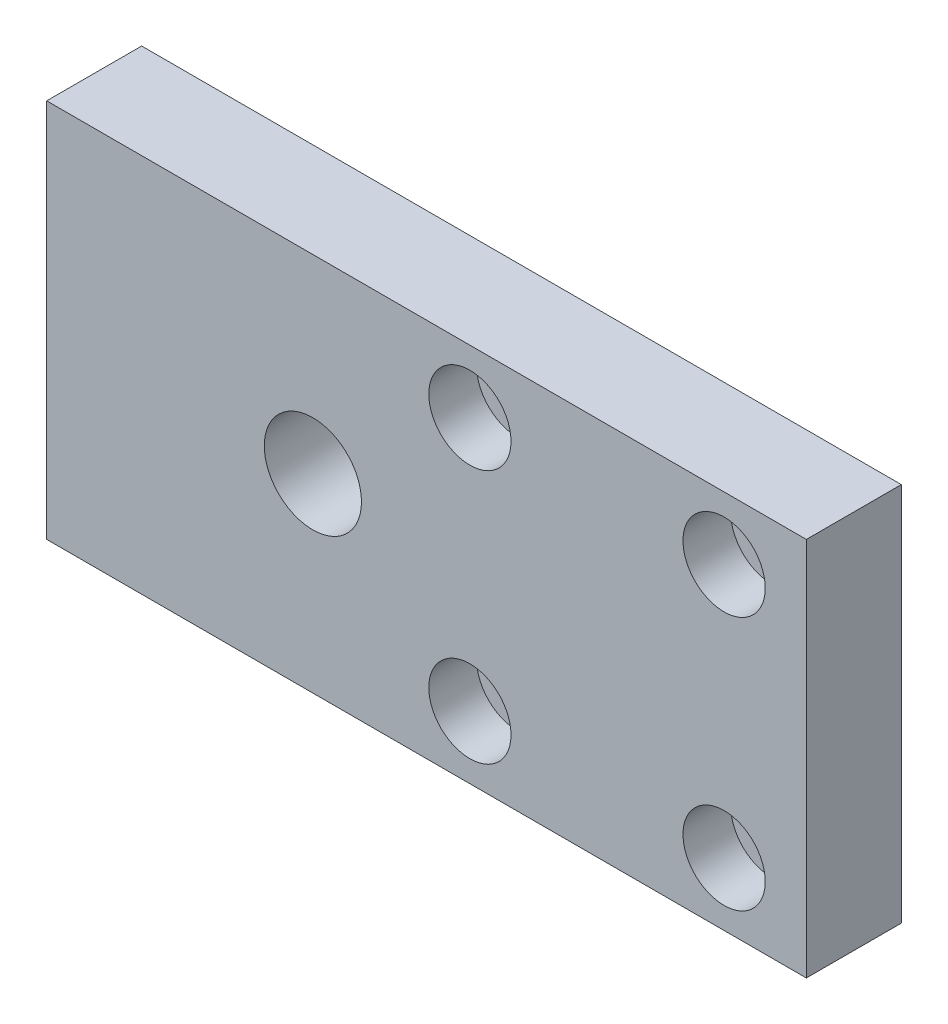
ISO-10303-21;
HEADER;
FILE_DESCRIPTION(('STEP AP214'),'2;1');
FILE_NAME('part.step','',(''),(''),'','','');
FILE_SCHEMA(('AUTOMOTIVE_DESIGN { 1 0 10303 214 1 1 1 1 }'));
ENDSEC;
DATA;
#1=APPLICATION_CONTEXT('core data for automotive mechanical design processes');
#2=APPLICATION_PROTOCOL_DEFINITION('international standard','automotive_design',2000,#1);
#3=PRODUCT_CONTEXT('',#1,'mechanical');
#4=PRODUCT('Part','Part','',(#3));
#5=PRODUCT_RELATED_PRODUCT_CATEGORY('part','',(#4));
#6=PRODUCT_DEFINITION_FORMATION('','',#4);
#7=PRODUCT_DEFINITION_CONTEXT('part definition',#1,'design');
#8=PRODUCT_DEFINITION('design','',#6,#7);
#9=PRODUCT_DEFINITION_SHAPE('','',#8);
#10=(LENGTH_UNIT() NAMED_UNIT(*) SI_UNIT(.MILLI.,.METRE.));
#11=(NAMED_UNIT(*) PLANE_ANGLE_UNIT() SI_UNIT($,.RADIAN.));
#12=(NAMED_UNIT(*) SI_UNIT($,.STERADIAN.) SOLID_ANGLE_UNIT());
#13=UNCERTAINTY_MEASURE_WITH_UNIT(LENGTH_MEASURE(1.E-05),#10,'distance_accuracy_value','');
#14=(GEOMETRIC_REPRESENTATION_CONTEXT(3) GLOBAL_UNCERTAINTY_ASSIGNED_CONTEXT((#13)) GLOBAL_UNIT_ASSIGNED_CONTEXT((#10,
#11,#12)) REPRESENTATION_CONTEXT('',''));
#15=CARTESIAN_POINT('',(0.,0.,0.));
#16=DIRECTION('',(0.,0.,1.));
#17=DIRECTION('',(1.,0.,0.));
#18=AXIS2_PLACEMENT_3D('',#15,#16,#17);
#19=CARTESIAN_POINT('',(0.,0.,6.35));
#20=DIRECTION('',(0.,0.,-1.));
#21=DIRECTION('',(-1.,0.,0.));
#22=AXIS2_PLACEMENT_3D('',#19,#20,#21);
#23=PLANE('',#22);
#24=CARTESIAN_POINT('',(5.79999999999999,17.,6.35));
#25=DIRECTION('',(0.,0.,1.));
#26=DIRECTION('',(1.,0.,0.));
#27=AXIS2_PLACEMENT_3D('',#24,#25,#26);
#28=CIRCLE('',#27,5.49999999999999);
#29=CARTESIAN_POINT('',(11.3,17.,6.35));
#30=VERTEX_POINT('',#29);
#31=EDGE_CURVE('E162',#30,#30,#28,.T.);
#32=ORIENTED_EDGE('',*,*,#31,.F.);
#33=EDGE_LOOP('',(#32));
#34=FACE_BOUND('',#33,.T.);
#35=CARTESIAN_POINT('',(39.8,17.,6.35));
#36=DIRECTION('',(0.,0.,1.));
#37=DIRECTION('',(1.,0.,0.));
#38=AXIS2_PLACEMENT_3D('',#35,#36,#37);
#39=CIRCLE('',#38,5.49999999999999);
#40=CARTESIAN_POINT('',(45.3,17.,6.35));
#41=VERTEX_POINT('',#40);
#42=EDGE_CURVE('E150',#41,#41,#39,.T.);
#43=ORIENTED_EDGE('',*,*,#42,.F.);
#44=EDGE_LOOP('',(#43));
#45=FACE_BOUND('',#44,.T.);
#46=CARTESIAN_POINT('',(39.8,-17.,6.35));
#47=DIRECTION('',(0.,0.,1.));
#48=DIRECTION('',(1.,0.,0.));
#49=AXIS2_PLACEMENT_3D('',#46,#47,#48);
#50=CIRCLE('',#49,5.49999999999999);
#51=CARTESIAN_POINT('',(45.3,-17.,6.35));
#52=VERTEX_POINT('',#51);
#53=EDGE_CURVE('E138',#52,#52,#50,.T.);
#54=ORIENTED_EDGE('',*,*,#53,.F.);
#55=EDGE_LOOP('',(#54));
#56=FACE_BOUND('',#55,.T.);
#57=CARTESIAN_POINT('',(5.80000000000001,-17.,6.35));
#58=DIRECTION('',(0.,0.,1.));
#59=DIRECTION('',(1.,0.,0.));
#60=AXIS2_PLACEMENT_3D('',#57,#58,#59);
#61=CIRCLE('',#60,5.49999999999999);
#62=CARTESIAN_POINT('',(11.3,-17.,6.35));
#63=VERTEX_POINT('',#62);
#64=EDGE_CURVE('E126',#63,#63,#61,.T.);
#65=ORIENTED_EDGE('',*,*,#64,.F.);
#66=EDGE_LOOP('',(#65));
#67=FACE_BOUND('',#66,.T.);
#68=DIRECTION('',(0.,-1.,0.));
#69=VECTOR('',#68,1.);
#70=CARTESIAN_POINT('',(-50.8,25.4,6.35));
#71=LINE('',#70,#69);
#72=CARTESIAN_POINT('',(-50.8,25.4,6.35));
#73=VERTEX_POINT('',#72);
#74=CARTESIAN_POINT('',(-50.8,-25.4,6.35));
#75=VERTEX_POINT('',#74);
#76=EDGE_CURVE('E85',#73,#75,#71,.T.);
#77=ORIENTED_EDGE('',*,*,#76,.T.);
#78=DIRECTION('',(1.,0.,0.));
#79=VECTOR('',#78,1.);
#80=CARTESIAN_POINT('',(50.8,-25.4,6.35));
#81=LINE('',#80,#79);
#82=CARTESIAN_POINT('',(50.8,-25.4,6.35));
#83=VERTEX_POINT('',#82);
#84=EDGE_CURVE('E80',#75,#83,#81,.T.);
#85=ORIENTED_EDGE('',*,*,#84,.T.);
#86=DIRECTION('',(0.,1.,0.));
#87=VECTOR('',#86,1.);
#88=CARTESIAN_POINT('',(50.8,25.4,6.35));
#89=LINE('',#88,#87);
#90=CARTESIAN_POINT('',(50.8,25.4,6.35));
#91=VERTEX_POINT('',#90);
#92=EDGE_CURVE('E83',#83,#91,#89,.T.);
#93=ORIENTED_EDGE('',*,*,#92,.T.);
#94=DIRECTION('',(-1.,0.,0.));
#95=VECTOR('',#94,1.);
#96=CARTESIAN_POINT('',(50.8,25.4,6.35));
#97=LINE('',#96,#95);
#98=EDGE_CURVE('E50',#91,#73,#97,.T.);
#99=ORIENTED_EDGE('',*,*,#98,.T.);
#100=EDGE_LOOP('',(#77,#85,#93,#99));
#101=FACE_BOUND('',#100,.T.);
#102=CARTESIAN_POINT('',(-15.2000000000002,0.,6.35));
#103=DIRECTION('',(0.,0.,1.));
#104=DIRECTION('',(1.,0.,0.));
#105=AXIS2_PLACEMENT_3D('',#102,#103,#104);
#106=CIRCLE('',#105,6.5);
#107=CARTESIAN_POINT('',(-8.70000000000015,0.,6.35));
#108=VERTEX_POINT('',#107);
#109=EDGE_CURVE('E100',#108,#108,#106,.T.);
#110=ORIENTED_EDGE('',*,*,#109,.F.);
#111=EDGE_LOOP('',(#110));
#112=FACE_BOUND('',#111,.T.);
#113=ADVANCED_FACE('F33',(#34,#45,#56,#67,#101,#112),#23,.F.);
#114=CARTESIAN_POINT('',(0.,0.,-6.35));
#115=DIRECTION('',(0.,0.,-1.));
#116=DIRECTION('',(-1.,0.,0.));
#117=AXIS2_PLACEMENT_3D('',#114,#115,#116);
#118=PLANE('',#117);
#119=CARTESIAN_POINT('',(5.79999999999999,17.,-6.35));
#120=DIRECTION('',(0.,0.,1.));
#121=DIRECTION('',(1.,0.,0.));
#122=AXIS2_PLACEMENT_3D('',#119,#120,#121);
#123=CIRCLE('',#122,3.3);
#124=CARTESIAN_POINT('',(9.1,17.,-6.35));
#125=VERTEX_POINT('',#124);
#126=EDGE_CURVE('E153',#125,#125,#123,.T.);
#127=ORIENTED_EDGE('',*,*,#126,.T.);
#128=EDGE_LOOP('',(#127));
#129=FACE_BOUND('',#128,.T.);
#130=CARTESIAN_POINT('',(39.8,17.,-6.35));
#131=DIRECTION('',(0.,0.,1.));
#132=DIRECTION('',(1.,0.,0.));
#133=AXIS2_PLACEMENT_3D('',#130,#131,#132);
#134=CIRCLE('',#133,3.3);
#135=CARTESIAN_POINT('',(43.1,17.,-6.35));
#136=VERTEX_POINT('',#135);
#137=EDGE_CURVE('E141',#136,#136,#134,.T.);
#138=ORIENTED_EDGE('',*,*,#137,.T.);
#139=EDGE_LOOP('',(#138));
#140=FACE_BOUND('',#139,.T.);
#141=CARTESIAN_POINT('',(39.8,-17.,-6.35));
#142=DIRECTION('',(0.,0.,1.));
#143=DIRECTION('',(1.,0.,0.));
#144=AXIS2_PLACEMENT_3D('',#141,#142,#143);
#145=CIRCLE('',#144,3.3);
#146=CARTESIAN_POINT('',(43.1,-17.,-6.35));
#147=VERTEX_POINT('',#146);
#148=EDGE_CURVE('E129',#147,#147,#145,.T.);
#149=ORIENTED_EDGE('',*,*,#148,.T.);
#150=EDGE_LOOP('',(#149));
#151=FACE_BOUND('',#150,.T.);
#152=CARTESIAN_POINT('',(5.80000000000001,-17.,-6.35));
#153=DIRECTION('',(0.,0.,1.));
#154=DIRECTION('',(1.,0.,0.));
#155=AXIS2_PLACEMENT_3D('',#152,#153,#154);
#156=CIRCLE('',#155,3.3);
#157=CARTESIAN_POINT('',(9.10000000000001,-17.,-6.35));
#158=VERTEX_POINT('',#157);
#159=EDGE_CURVE('E115',#158,#158,#156,.T.);
#160=ORIENTED_EDGE('',*,*,#159,.T.);
#161=EDGE_LOOP('',(#160));
#162=FACE_BOUND('',#161,.T.);
#163=DIRECTION('',(0.,-1.,0.));
#164=VECTOR('',#163,1.);
#165=CARTESIAN_POINT('',(-50.8,25.4,-6.35));
#166=LINE('',#165,#164);
#167=CARTESIAN_POINT('',(-50.8,25.4,-6.35));
#168=VERTEX_POINT('',#167);
#169=CARTESIAN_POINT('',(-50.8,-25.4,-6.35));
#170=VERTEX_POINT('',#169);
#171=EDGE_CURVE('E97',#168,#170,#166,.T.);
#172=ORIENTED_EDGE('',*,*,#171,.F.);
#173=DIRECTION('',(-1.,0.,0.));
#174=VECTOR('',#173,1.);
#175=CARTESIAN_POINT('',(50.8,25.4,-6.35));
#176=LINE('',#175,#174);
#177=CARTESIAN_POINT('',(50.8,25.4,-6.35));
#178=VERTEX_POINT('',#177);
#179=EDGE_CURVE('E73',#178,#168,#176,.T.);
#180=ORIENTED_EDGE('',*,*,#179,.F.);
#181=DIRECTION('',(0.,1.,0.));
#182=VECTOR('',#181,1.);
#183=CARTESIAN_POINT('',(50.8,25.4,-6.35));
#184=LINE('',#183,#182);
#185=CARTESIAN_POINT('',(50.8,-25.4,-6.35));
#186=VERTEX_POINT('',#185);
#187=EDGE_CURVE('E67',#186,#178,#184,.T.);
#188=ORIENTED_EDGE('',*,*,#187,.F.);
#189=DIRECTION('',(1.,0.,0.));
#190=VECTOR('',#189,1.);
#191=CARTESIAN_POINT('',(50.8,-25.4,-6.35));
#192=LINE('',#191,#190);
#193=EDGE_CURVE('E89',#170,#186,#192,.T.);
#194=ORIENTED_EDGE('',*,*,#193,.F.);
#195=EDGE_LOOP('',(#172,#180,#188,#194));
#196=FACE_BOUND('',#195,.T.);
#197=CARTESIAN_POINT('',(-15.2000000000002,0.,-6.35));
#198=DIRECTION('',(0.,0.,1.));
#199=DIRECTION('',(1.,0.,0.));
#200=AXIS2_PLACEMENT_3D('',#197,#198,#199);
#201=CIRCLE('',#200,6.5);
#202=CARTESIAN_POINT('',(-8.70000000000015,0.,-6.35));
#203=VERTEX_POINT('',#202);
#204=EDGE_CURVE('E112',#203,#203,#201,.T.);
#205=ORIENTED_EDGE('',*,*,#204,.T.);
#206=EDGE_LOOP('',(#205));
#207=FACE_BOUND('',#206,.T.);
#208=ADVANCED_FACE('F108',(#129,#140,#151,#162,#196,#207),#118,.T.);
#209=CARTESIAN_POINT('',(-50.8,25.4,6.35));
#210=DIRECTION('',(1.,0.,0.));
#211=DIRECTION('',(0.,0.,-1.));
#212=AXIS2_PLACEMENT_3D('',#209,#210,#211);
#213=PLANE('',#212);
#214=ORIENTED_EDGE('',*,*,#171,.T.);
#215=DIRECTION('',(0.,0.,-1.));
#216=VECTOR('',#215,1.);
#217=CARTESIAN_POINT('',(-50.8,-25.4,6.35));
#218=LINE('',#217,#216);
#219=EDGE_CURVE('E11',#75,#170,#218,.T.);
#220=ORIENTED_EDGE('',*,*,#219,.F.);
#221=ORIENTED_EDGE('',*,*,#76,.F.);
#222=DIRECTION('',(0.,0.,-1.));
#223=VECTOR('',#222,1.);
#224=CARTESIAN_POINT('',(-50.8,25.4,6.35));
#225=LINE('',#224,#223);
#226=EDGE_CURVE('E93',#73,#168,#225,.T.);
#227=ORIENTED_EDGE('',*,*,#226,.T.);
#228=EDGE_LOOP('',(#214,#220,#221,#227));
#229=FACE_BOUND('',#228,.T.);
#230=ADVANCED_FACE('F35',(#229),#213,.F.);
#231=CARTESIAN_POINT('',(50.8,-25.4,6.35));
#232=DIRECTION('',(0.,1.,0.));
#233=DIRECTION('',(-1.,0.,0.));
#234=AXIS2_PLACEMENT_3D('',#231,#232,#233);
#235=PLANE('',#234);
#236=ORIENTED_EDGE('',*,*,#193,.T.);
#237=DIRECTION('',(0.,0.,-1.));
#238=VECTOR('',#237,1.);
#239=CARTESIAN_POINT('',(50.8,-25.4,6.35));
#240=LINE('',#239,#238);
#241=EDGE_CURVE('E42',#83,#186,#240,.T.);
#242=ORIENTED_EDGE('',*,*,#241,.F.);
#243=ORIENTED_EDGE('',*,*,#84,.F.);
#244=ORIENTED_EDGE('',*,*,#219,.T.);
#245=EDGE_LOOP('',(#236,#242,#243,#244));
#246=FACE_BOUND('',#245,.T.);
#247=ADVANCED_FACE('F88',(#246),#235,.F.);
#248=CARTESIAN_POINT('',(50.8,25.4,6.35));
#249=DIRECTION('',(-1.,0.,0.));
#250=DIRECTION('',(0.,-1.,0.));
#251=AXIS2_PLACEMENT_3D('',#248,#249,#250);
#252=PLANE('',#251);
#253=ORIENTED_EDGE('',*,*,#187,.T.);
#254=DIRECTION('',(0.,0.,-1.));
#255=VECTOR('',#254,1.);
#256=CARTESIAN_POINT('',(50.8,25.4,6.35));
#257=LINE('',#256,#255);
#258=EDGE_CURVE('E90',#91,#178,#257,.T.);
#259=ORIENTED_EDGE('',*,*,#258,.F.);
#260=ORIENTED_EDGE('',*,*,#92,.F.);
#261=ORIENTED_EDGE('',*,*,#241,.T.);
#262=EDGE_LOOP('',(#253,#259,#260,#261));
#263=FACE_BOUND('',#262,.T.);
#264=ADVANCED_FACE('F91',(#263),#252,.F.);
#265=CARTESIAN_POINT('',(50.8,25.4,6.35));
#266=DIRECTION('',(0.,-1.,0.));
#267=DIRECTION('',(1.,0.,0.));
#268=AXIS2_PLACEMENT_3D('',#265,#266,#267);
#269=PLANE('',#268);
#270=ORIENTED_EDGE('',*,*,#179,.T.);
#271=ORIENTED_EDGE('',*,*,#226,.F.);
#272=ORIENTED_EDGE('',*,*,#98,.F.);
#273=ORIENTED_EDGE('',*,*,#258,.T.);
#274=EDGE_LOOP('',(#270,#271,#272,#273));
#275=FACE_BOUND('',#274,.T.);
#276=ADVANCED_FACE('F105',(#275),#269,.F.);
#277=CARTESIAN_POINT('',(-15.2000000000002,0.,6.35));
#278=DIRECTION('',(0.,0.,-1.));
#279=DIRECTION('',(-1.,0.,0.));
#280=AXIS2_PLACEMENT_3D('',#277,#278,#279);
#281=CYLINDRICAL_SURFACE('',#280,6.5);
#282=ORIENTED_EDGE('',*,*,#109,.T.);
#283=EDGE_LOOP('',(#282));
#284=FACE_BOUND('',#283,.T.);
#285=ORIENTED_EDGE('',*,*,#204,.F.);
#286=EDGE_LOOP('',(#285));
#287=FACE_BOUND('',#286,.T.);
#288=ADVANCED_FACE('F198',(#284,#287),#281,.F.);
#289=CARTESIAN_POINT('',(5.80000000000001,-17.,6.35));
#290=DIRECTION('',(0.,0.,1.));
#291=DIRECTION('',(1.,0.,0.));
#292=AXIS2_PLACEMENT_3D('',#289,#290,#291);
#293=CYLINDRICAL_SURFACE('',#292,3.3);
#294=ORIENTED_EDGE('',*,*,#159,.F.);
#295=EDGE_LOOP('',(#294));
#296=FACE_BOUND('',#295,.T.);
#297=CARTESIAN_POINT('',(5.80000000000001,-17.,-0.0499999999999997));
#298=DIRECTION('',(0.,0.,1.));
#299=DIRECTION('',(1.,0.,0.));
#300=AXIS2_PLACEMENT_3D('',#297,#298,#299);
#301=CIRCLE('',#300,3.3);
#302=CARTESIAN_POINT('',(9.1,-17.,-0.0499999999999997));
#303=VERTEX_POINT('',#302);
#304=EDGE_CURVE('E120',#303,#303,#301,.T.);
#305=ORIENTED_EDGE('',*,*,#304,.T.);
#306=EDGE_LOOP('',(#305));
#307=FACE_BOUND('',#306,.T.);
#308=ADVANCED_FACE('F190',(#296,#307),#293,.F.);
#309=CARTESIAN_POINT('',(9.1,-17.,-0.0499999999999997));
#310=DIRECTION('',(0.,0.,-1.));
#311=DIRECTION('',(-1.,0.,0.));
#312=AXIS2_PLACEMENT_3D('',#309,#310,#311);
#313=PLANE('',#312);
#314=ORIENTED_EDGE('',*,*,#304,.F.);
#315=EDGE_LOOP('',(#314));
#316=FACE_BOUND('',#315,.T.);
#317=CARTESIAN_POINT('',(5.80000000000001,-17.,-0.0499999999999997));
#318=DIRECTION('',(0.,0.,1.));
#319=DIRECTION('',(1.,0.,0.));
#320=AXIS2_PLACEMENT_3D('',#317,#318,#319);
#321=CIRCLE('',#320,5.5);
#322=CARTESIAN_POINT('',(11.3,-17.,-0.0499999999999997));
#323=VERTEX_POINT('',#322);
#324=EDGE_CURVE('E123',#323,#323,#321,.T.);
#325=ORIENTED_EDGE('',*,*,#324,.T.);
#326=EDGE_LOOP('',(#325));
#327=FACE_BOUND('',#326,.T.);
#328=ADVANCED_FACE('F180',(#316,#327),#313,.F.);
#329=CARTESIAN_POINT('',(5.80000000000001,-17.,6.35));
#330=DIRECTION('',(0.,0.,1.));
#331=DIRECTION('',(1.,0.,0.));
#332=AXIS2_PLACEMENT_3D('',#329,#330,#331);
#333=CYLINDRICAL_SURFACE('',#332,5.5);
#334=ORIENTED_EDGE('',*,*,#324,.F.);
#335=EDGE_LOOP('',(#334));
#336=FACE_BOUND('',#335,.T.);
#337=ORIENTED_EDGE('',*,*,#64,.T.);
#338=EDGE_LOOP('',(#337));
#339=FACE_BOUND('',#338,.T.);
#340=ADVANCED_FACE('F177',(#336,#339),#333,.F.);
#341=CARTESIAN_POINT('',(39.8,-17.,6.35));
#342=DIRECTION('',(0.,0.,1.));
#343=DIRECTION('',(1.,0.,0.));
#344=AXIS2_PLACEMENT_3D('',#341,#342,#343);
#345=CYLINDRICAL_SURFACE('',#344,3.3);
#346=ORIENTED_EDGE('',*,*,#148,.F.);
#347=EDGE_LOOP('',(#346));
#348=FACE_BOUND('',#347,.T.);
#349=CARTESIAN_POINT('',(39.8,-17.,-0.0499999999999997));
#350=DIRECTION('',(0.,0.,1.));
#351=DIRECTION('',(1.,0.,0.));
#352=AXIS2_PLACEMENT_3D('',#349,#350,#351);
#353=CIRCLE('',#352,3.3);
#354=CARTESIAN_POINT('',(43.1,-17.,-0.0499999999999997));
#355=VERTEX_POINT('',#354);
#356=EDGE_CURVE('E132',#355,#355,#353,.T.);
#357=ORIENTED_EDGE('',*,*,#356,.T.);
#358=EDGE_LOOP('',(#357));
#359=FACE_BOUND('',#358,.T.);
#360=ADVANCED_FACE('F179',(#348,#359),#345,.F.);
#361=CARTESIAN_POINT('',(43.1,-17.,-0.0499999999999997));
#362=DIRECTION('',(0.,0.,-1.));
#363=DIRECTION('',(-1.,0.,0.));
#364=AXIS2_PLACEMENT_3D('',#361,#362,#363);
#365=PLANE('',#364);
#366=ORIENTED_EDGE('',*,*,#356,.F.);
#367=EDGE_LOOP('',(#366));
#368=FACE_BOUND('',#367,.T.);
#369=CARTESIAN_POINT('',(39.8,-17.,-0.0499999999999997));
#370=DIRECTION('',(0.,0.,1.));
#371=DIRECTION('',(1.,0.,0.));
#372=AXIS2_PLACEMENT_3D('',#369,#370,#371);
#373=CIRCLE('',#372,5.5);
#374=CARTESIAN_POINT('',(45.3,-17.,-0.0499999999999997));
#375=VERTEX_POINT('',#374);
#376=EDGE_CURVE('E135',#375,#375,#373,.T.);
#377=ORIENTED_EDGE('',*,*,#376,.T.);
#378=EDGE_LOOP('',(#377));
#379=FACE_BOUND('',#378,.T.);
#380=ADVANCED_FACE('F187',(#368,#379),#365,.F.);
#381=CARTESIAN_POINT('',(39.8,-17.,6.35));
#382=DIRECTION('',(0.,0.,1.));
#383=DIRECTION('',(1.,0.,0.));
#384=AXIS2_PLACEMENT_3D('',#381,#382,#383);
#385=CYLINDRICAL_SURFACE('',#384,5.49999999999999);
#386=ORIENTED_EDGE('',*,*,#376,.F.);
#387=EDGE_LOOP('',(#386));
#388=FACE_BOUND('',#387,.T.);
#389=ORIENTED_EDGE('',*,*,#53,.T.);
#390=EDGE_LOOP('',(#389));
#391=FACE_BOUND('',#390,.T.);
#392=ADVANCED_FACE('F278',(#388,#391),#385,.F.);
#393=CARTESIAN_POINT('',(39.8,17.,6.35));
#394=DIRECTION('',(0.,0.,1.));
#395=DIRECTION('',(1.,0.,0.));
#396=AXIS2_PLACEMENT_3D('',#393,#394,#395);
#397=CYLINDRICAL_SURFACE('',#396,3.3);
#398=ORIENTED_EDGE('',*,*,#137,.F.);
#399=EDGE_LOOP('',(#398));
#400=FACE_BOUND('',#399,.T.);
#401=CARTESIAN_POINT('',(39.8,17.,-0.0499999999999997));
#402=DIRECTION('',(0.,0.,1.));
#403=DIRECTION('',(1.,0.,0.));
#404=AXIS2_PLACEMENT_3D('',#401,#402,#403);
#405=CIRCLE('',#404,3.3);
#406=CARTESIAN_POINT('',(43.1,17.,-0.0499999999999997));
#407=VERTEX_POINT('',#406);
#408=EDGE_CURVE('E144',#407,#407,#405,.T.);
#409=ORIENTED_EDGE('',*,*,#408,.T.);
#410=EDGE_LOOP('',(#409));
#411=FACE_BOUND('',#410,.T.);
#412=ADVANCED_FACE('F287',(#400,#411),#397,.F.);
#413=CARTESIAN_POINT('',(43.1,17.,-0.0499999999999997));
#414=DIRECTION('',(0.,0.,-1.));
#415=DIRECTION('',(-1.,0.,0.));
#416=AXIS2_PLACEMENT_3D('',#413,#414,#415);
#417=PLANE('',#416);
#418=ORIENTED_EDGE('',*,*,#408,.F.);
#419=EDGE_LOOP('',(#418));
#420=FACE_BOUND('',#419,.T.);
#421=CARTESIAN_POINT('',(39.8,17.,-0.0499999999999997));
#422=DIRECTION('',(0.,0.,1.));
#423=DIRECTION('',(1.,0.,0.));
#424=AXIS2_PLACEMENT_3D('',#421,#422,#423);
#425=CIRCLE('',#424,5.5);
#426=CARTESIAN_POINT('',(45.3,17.,-0.0499999999999997));
#427=VERTEX_POINT('',#426);
#428=EDGE_CURVE('E147',#427,#427,#425,.T.);
#429=ORIENTED_EDGE('',*,*,#428,.T.);
#430=EDGE_LOOP('',(#429));
#431=FACE_BOUND('',#430,.T.);
#432=ADVANCED_FACE('F297',(#420,#431),#417,.F.);
#433=CARTESIAN_POINT('',(39.8,17.,6.35));
#434=DIRECTION('',(0.,0.,1.));
#435=DIRECTION('',(1.,0.,0.));
#436=AXIS2_PLACEMENT_3D('',#433,#434,#435);
#437=CYLINDRICAL_SURFACE('',#436,5.49999999999999);
#438=ORIENTED_EDGE('',*,*,#428,.F.);
#439=EDGE_LOOP('',(#438));
#440=FACE_BOUND('',#439,.T.);
#441=ORIENTED_EDGE('',*,*,#42,.T.);
#442=EDGE_LOOP('',(#441));
#443=FACE_BOUND('',#442,.T.);
#444=ADVANCED_FACE('F307',(#440,#443),#437,.F.);
#445=CARTESIAN_POINT('',(5.79999999999999,17.,6.35));
#446=DIRECTION('',(0.,0.,1.));
#447=DIRECTION('',(1.,0.,0.));
#448=AXIS2_PLACEMENT_3D('',#445,#446,#447);
#449=CYLINDRICAL_SURFACE('',#448,3.3);
#450=ORIENTED_EDGE('',*,*,#126,.F.);
#451=EDGE_LOOP('',(#450));
#452=FACE_BOUND('',#451,.T.);
#453=CARTESIAN_POINT('',(5.79999999999999,17.,-0.0499999999999997));
#454=DIRECTION('',(0.,0.,1.));
#455=DIRECTION('',(1.,0.,0.));
#456=AXIS2_PLACEMENT_3D('',#453,#454,#455);
#457=CIRCLE('',#456,3.3);
#458=CARTESIAN_POINT('',(9.09999999999999,17.,-0.0499999999999997));
#459=VERTEX_POINT('',#458);
#460=EDGE_CURVE('E156',#459,#459,#457,.T.);
#461=ORIENTED_EDGE('',*,*,#460,.T.);
#462=EDGE_LOOP('',(#461));
#463=FACE_BOUND('',#462,.T.);
#464=ADVANCED_FACE('F317',(#452,#463),#449,.F.);
#465=CARTESIAN_POINT('',(9.09999999999999,17.,-0.0499999999999997));
#466=DIRECTION('',(0.,0.,-1.));
#467=DIRECTION('',(-1.,0.,0.));
#468=AXIS2_PLACEMENT_3D('',#465,#466,#467);
#469=PLANE('',#468);
#470=ORIENTED_EDGE('',*,*,#460,.F.);
#471=EDGE_LOOP('',(#470));
#472=FACE_BOUND('',#471,.T.);
#473=CARTESIAN_POINT('',(5.79999999999999,17.,-0.0499999999999997));
#474=DIRECTION('',(0.,0.,1.));
#475=DIRECTION('',(1.,0.,0.));
#476=AXIS2_PLACEMENT_3D('',#473,#474,#475);
#477=CIRCLE('',#476,5.5);
#478=CARTESIAN_POINT('',(11.3,17.,-0.0499999999999997));
#479=VERTEX_POINT('',#478);
#480=EDGE_CURVE('E159',#479,#479,#477,.T.);
#481=ORIENTED_EDGE('',*,*,#480,.T.);
#482=EDGE_LOOP('',(#481));
#483=FACE_BOUND('',#482,.T.);
#484=ADVANCED_FACE('F327',(#472,#483),#469,.F.);
#485=CARTESIAN_POINT('',(5.79999999999999,17.,6.35));
#486=DIRECTION('',(0.,0.,1.));
#487=DIRECTION('',(1.,0.,0.));
#488=AXIS2_PLACEMENT_3D('',#485,#486,#487);
#489=CYLINDRICAL_SURFACE('',#488,5.5);
#490=ORIENTED_EDGE('',*,*,#480,.F.);
#491=EDGE_LOOP('',(#490));
#492=FACE_BOUND('',#491,.T.);
#493=ORIENTED_EDGE('',*,*,#31,.T.);
#494=EDGE_LOOP('',(#493));
#495=FACE_BOUND('',#494,.T.);
#496=ADVANCED_FACE('F166',(#492,#495),#489,.F.);
#497=CLOSED_SHELL('',(#113,#208,#230,#247,#264,#276,#288,#308,#328,#340,#360,#380,#392,#412,
#432,#444,#464,#484,#496));
#498=MANIFOLD_SOLID_BREP('B2',#497);
#499=ADVANCED_BREP_SHAPE_REPRESENTATION('',(#18,#498),#14);
#500=SHAPE_DEFINITION_REPRESENTATION(#9,#499);
ENDSEC;
END-ISO-10303-21;
